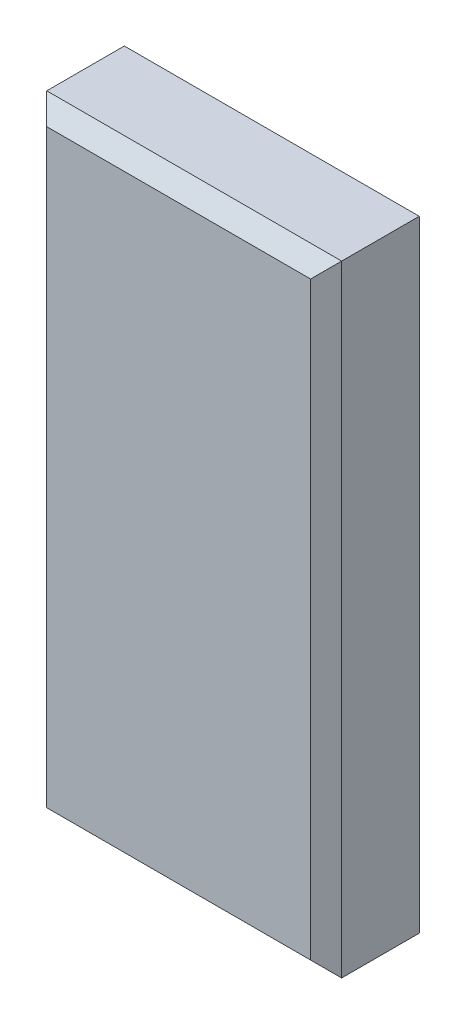
ISO-10303-21;
HEADER;
FILE_DESCRIPTION(('STEP AP214'),'2;1');
FILE_NAME('part.step','',(''),(''),'','','');
FILE_SCHEMA(('AUTOMOTIVE_DESIGN { 1 0 10303 214 1 1 1 1 }'));
ENDSEC;
DATA;
#1=APPLICATION_CONTEXT('core data for automotive mechanical design processes');
#2=APPLICATION_PROTOCOL_DEFINITION('international standard','automotive_design',2000,#1);
#3=PRODUCT_CONTEXT('',#1,'mechanical');
#4=PRODUCT('Part','Part','',(#3));
#5=PRODUCT_RELATED_PRODUCT_CATEGORY('part','',(#4));
#6=PRODUCT_DEFINITION_FORMATION('','',#4);
#7=PRODUCT_DEFINITION_CONTEXT('part definition',#1,'design');
#8=PRODUCT_DEFINITION('design','',#6,#7);
#9=PRODUCT_DEFINITION_SHAPE('','',#8);
#10=(LENGTH_UNIT() NAMED_UNIT(*) SI_UNIT(.MILLI.,.METRE.));
#11=(NAMED_UNIT(*) PLANE_ANGLE_UNIT() SI_UNIT($,.RADIAN.));
#12=(NAMED_UNIT(*) SI_UNIT($,.STERADIAN.) SOLID_ANGLE_UNIT());
#13=UNCERTAINTY_MEASURE_WITH_UNIT(LENGTH_MEASURE(1.E-05),#10,'distance_accuracy_value','');
#14=(GEOMETRIC_REPRESENTATION_CONTEXT(3) GLOBAL_UNCERTAINTY_ASSIGNED_CONTEXT((#13)) GLOBAL_UNIT_ASSIGNED_CONTEXT((#10,
#11,#12)) REPRESENTATION_CONTEXT('',''));
#15=CARTESIAN_POINT('',(0.,0.,0.));
#16=DIRECTION('',(0.,0.,1.));
#17=DIRECTION('',(1.,0.,0.));
#18=AXIS2_PLACEMENT_3D('',#15,#16,#17);
#19=CARTESIAN_POINT('',(9.5,20.,7.));
#20=DIRECTION('',(-1.,0.,0.));
#21=DIRECTION('',(0.,-1.,0.));
#22=AXIS2_PLACEMENT_3D('',#19,#20,#21);
#23=PLANE('',#22);
#24=DIRECTION('',(0.,0.,-1.));
#25=VECTOR('',#24,1.);
#26=CARTESIAN_POINT('',(9.5,-20.,7.));
#27=LINE('',#26,#25);
#28=CARTESIAN_POINT('',(9.5,-20.,6.));
#29=VERTEX_POINT('',#28);
#30=CARTESIAN_POINT('',(9.5,-20.,1.));
#31=VERTEX_POINT('',#30);
#32=EDGE_CURVE('E145',#29,#31,#27,.T.);
#33=ORIENTED_EDGE('',*,*,#32,.T.);
#34=DIRECTION('',(0.,1.,0.));
#35=VECTOR('',#34,1.);
#36=CARTESIAN_POINT('',(9.5,20.,1.));
#37=LINE('',#36,#35);
#38=CARTESIAN_POINT('',(9.5,20.,1.));
#39=VERTEX_POINT('',#38);
#40=EDGE_CURVE('E154',#31,#39,#37,.T.);
#41=ORIENTED_EDGE('',*,*,#40,.T.);
#42=DIRECTION('',(0.,0.,-1.));
#43=VECTOR('',#42,1.);
#44=CARTESIAN_POINT('',(9.5,20.,7.));
#45=LINE('',#44,#43);
#46=CARTESIAN_POINT('',(9.5,20.,6.));
#47=VERTEX_POINT('',#46);
#48=EDGE_CURVE('E123',#47,#39,#45,.T.);
#49=ORIENTED_EDGE('',*,*,#48,.F.);
#50=DIRECTION('',(0.,-1.,0.));
#51=VECTOR('',#50,1.);
#52=CARTESIAN_POINT('',(9.5,-20.,6.));
#53=LINE('',#52,#51);
#54=EDGE_CURVE('E156',#47,#29,#53,.T.);
#55=ORIENTED_EDGE('',*,*,#54,.T.);
#56=EDGE_LOOP('',(#33,#41,#49,#55));
#57=FACE_BOUND('',#56,.T.);
#58=ADVANCED_FACE('F35',(#57),#23,.F.);
#59=CARTESIAN_POINT('',(-9.5,20.,7.));
#60=DIRECTION('',(0.,-1.,0.));
#61=DIRECTION('',(0.,0.,-1.));
#62=AXIS2_PLACEMENT_3D('',#59,#60,#61);
#63=PLANE('',#62);
#64=ORIENTED_EDGE('',*,*,#48,.T.);
#65=DIRECTION('',(-1.,0.,0.));
#66=VECTOR('',#65,1.);
#67=CARTESIAN_POINT('',(-9.5,20.,1.));
#68=LINE('',#67,#66);
#69=CARTESIAN_POINT('',(-9.5,20.,1.));
#70=VERTEX_POINT('',#69);
#71=EDGE_CURVE('E122',#39,#70,#68,.T.);
#72=ORIENTED_EDGE('',*,*,#71,.T.);
#73=DIRECTION('',(0.,0.,-1.));
#74=VECTOR('',#73,1.);
#75=CARTESIAN_POINT('',(-9.5,20.,7.));
#76=LINE('',#75,#74);
#77=CARTESIAN_POINT('',(-9.5,20.,6.));
#78=VERTEX_POINT('',#77);
#79=EDGE_CURVE('E105',#78,#70,#76,.T.);
#80=ORIENTED_EDGE('',*,*,#79,.F.);
#81=DIRECTION('',(1.,0.,0.));
#82=VECTOR('',#81,1.);
#83=CARTESIAN_POINT('',(9.5,20.,6.));
#84=LINE('',#83,#82);
#85=EDGE_CURVE('E119',#78,#47,#84,.T.);
#86=ORIENTED_EDGE('',*,*,#85,.T.);
#87=EDGE_LOOP('',(#64,#72,#80,#86));
#88=FACE_BOUND('',#87,.T.);
#89=ADVANCED_FACE('F118',(#88),#63,.F.);
#90=CARTESIAN_POINT('',(-9.5,20.,7.));
#91=DIRECTION('',(1.,0.,0.));
#92=DIRECTION('',(0.,1.,0.));
#93=AXIS2_PLACEMENT_3D('',#90,#91,#92);
#94=PLANE('',#93);
#95=ORIENTED_EDGE('',*,*,#79,.T.);
#96=DIRECTION('',(0.,-1.,0.));
#97=VECTOR('',#96,1.);
#98=CARTESIAN_POINT('',(-9.5,20.,1.));
#99=LINE('',#98,#97);
#100=CARTESIAN_POINT('',(-9.5,-20.,1.));
#101=VERTEX_POINT('',#100);
#102=EDGE_CURVE('E111',#70,#101,#99,.T.);
#103=ORIENTED_EDGE('',*,*,#102,.T.);
#104=DIRECTION('',(0.,0.,-1.));
#105=VECTOR('',#104,1.);
#106=CARTESIAN_POINT('',(-9.5,-20.,7.));
#107=LINE('',#106,#105);
#108=CARTESIAN_POINT('',(-9.5,-20.,6.));
#109=VERTEX_POINT('',#108);
#110=EDGE_CURVE('E107',#109,#101,#107,.T.);
#111=ORIENTED_EDGE('',*,*,#110,.F.);
#112=DIRECTION('',(0.,1.,0.));
#113=VECTOR('',#112,1.);
#114=CARTESIAN_POINT('',(-9.5,20.,6.));
#115=LINE('',#114,#113);
#116=EDGE_CURVE('E102',#109,#78,#115,.T.);
#117=ORIENTED_EDGE('',*,*,#116,.T.);
#118=EDGE_LOOP('',(#95,#103,#111,#117));
#119=FACE_BOUND('',#118,.T.);
#120=ADVANCED_FACE('F104',(#119),#94,.F.);
#121=CARTESIAN_POINT('',(-9.5,-20.,7.));
#122=DIRECTION('',(0.,1.,0.));
#123=DIRECTION('',(0.,0.,1.));
#124=AXIS2_PLACEMENT_3D('',#121,#122,#123);
#125=PLANE('',#124);
#126=ORIENTED_EDGE('',*,*,#110,.T.);
#127=DIRECTION('',(1.,0.,0.));
#128=VECTOR('',#127,1.);
#129=CARTESIAN_POINT('',(-9.5,-20.,1.));
#130=LINE('',#129,#128);
#131=EDGE_CURVE('E158',#101,#31,#130,.T.);
#132=ORIENTED_EDGE('',*,*,#131,.T.);
#133=ORIENTED_EDGE('',*,*,#32,.F.);
#134=DIRECTION('',(-1.,0.,0.));
#135=VECTOR('',#134,1.);
#136=CARTESIAN_POINT('',(-9.5,-20.,6.));
#137=LINE('',#136,#135);
#138=EDGE_CURVE('E160',#29,#109,#137,.T.);
#139=ORIENTED_EDGE('',*,*,#138,.T.);
#140=EDGE_LOOP('',(#126,#132,#133,#139));
#141=FACE_BOUND('',#140,.T.);
#142=ADVANCED_FACE('F198',(#141),#125,.F.);
#143=CARTESIAN_POINT('',(0.,0.,7.));
#144=DIRECTION('',(0.,0.,1.));
#145=DIRECTION('',(1.,0.,0.));
#146=AXIS2_PLACEMENT_3D('',#143,#144,#145);
#147=PLANE('',#146);
#148=DIRECTION('',(0.,-1.,0.));
#149=VECTOR('',#148,1.);
#150=CARTESIAN_POINT('',(-8.49999999999999,-20.,7.));
#151=LINE('',#150,#149);
#152=CARTESIAN_POINT('',(-8.5,19.,7.));
#153=VERTEX_POINT('',#152);
#154=CARTESIAN_POINT('',(-8.49999999999999,-19.,7.));
#155=VERTEX_POINT('',#154);
#156=EDGE_CURVE('E45',#153,#155,#151,.T.);
#157=ORIENTED_EDGE('',*,*,#156,.T.);
#158=DIRECTION('',(1.,0.,0.));
#159=VECTOR('',#158,1.);
#160=CARTESIAN_POINT('',(9.5,-19.,7.));
#161=LINE('',#160,#159);
#162=CARTESIAN_POINT('',(8.5,-19.,7.));
#163=VERTEX_POINT('',#162);
#164=EDGE_CURVE('E11',#155,#163,#161,.T.);
#165=ORIENTED_EDGE('',*,*,#164,.T.);
#166=DIRECTION('',(0.,1.,0.));
#167=VECTOR('',#166,1.);
#168=CARTESIAN_POINT('',(8.5,20.,7.));
#169=LINE('',#168,#167);
#170=CARTESIAN_POINT('',(8.5,19.,7.));
#171=VERTEX_POINT('',#170);
#172=EDGE_CURVE('E152',#163,#171,#169,.T.);
#173=ORIENTED_EDGE('',*,*,#172,.T.);
#174=DIRECTION('',(-1.,0.,0.));
#175=VECTOR('',#174,1.);
#176=CARTESIAN_POINT('',(-9.5,19.,7.));
#177=LINE('',#176,#175);
#178=EDGE_CURVE('E56',#171,#153,#177,.T.);
#179=ORIENTED_EDGE('',*,*,#178,.T.);
#180=EDGE_LOOP('',(#157,#165,#173,#179));
#181=FACE_BOUND('',#180,.T.);
#182=ADVANCED_FACE('F204',(#181),#147,.T.);
#183=CARTESIAN_POINT('',(0.,0.,0.));
#184=DIRECTION('',(0.,0.,1.));
#185=DIRECTION('',(1.,0.,0.));
#186=AXIS2_PLACEMENT_3D('',#183,#184,#185);
#187=PLANE('',#186);
#188=DIRECTION('',(0.,1.,0.));
#189=VECTOR('',#188,1.);
#190=CARTESIAN_POINT('',(-8.5,0.,0.));
#191=LINE('',#190,#189);
#192=CARTESIAN_POINT('',(-8.49999999999999,-19.,0.));
#193=VERTEX_POINT('',#192);
#194=CARTESIAN_POINT('',(-8.5,19.,0.));
#195=VERTEX_POINT('',#194);
#196=EDGE_CURVE('E165',#193,#195,#191,.T.);
#197=ORIENTED_EDGE('',*,*,#196,.T.);
#198=DIRECTION('',(1.,0.,0.));
#199=VECTOR('',#198,1.);
#200=CARTESIAN_POINT('',(0.,19.,0.));
#201=LINE('',#200,#199);
#202=CARTESIAN_POINT('',(8.5,19.,0.));
#203=VERTEX_POINT('',#202);
#204=EDGE_CURVE('E112',#195,#203,#201,.T.);
#205=ORIENTED_EDGE('',*,*,#204,.T.);
#206=DIRECTION('',(0.,-1.,0.));
#207=VECTOR('',#206,1.);
#208=CARTESIAN_POINT('',(8.5,0.,0.));
#209=LINE('',#208,#207);
#210=CARTESIAN_POINT('',(8.5,-19.,0.));
#211=VERTEX_POINT('',#210);
#212=EDGE_CURVE('E169',#203,#211,#209,.T.);
#213=ORIENTED_EDGE('',*,*,#212,.T.);
#214=DIRECTION('',(-1.,0.,0.));
#215=VECTOR('',#214,1.);
#216=CARTESIAN_POINT('',(0.,-19.,0.));
#217=LINE('',#216,#215);
#218=EDGE_CURVE('E167',#211,#193,#217,.T.);
#219=ORIENTED_EDGE('',*,*,#218,.T.);
#220=EDGE_LOOP('',(#197,#205,#213,#219));
#221=FACE_BOUND('',#220,.T.);
#222=ADVANCED_FACE('F206',(#221),#187,.F.);
#223=CARTESIAN_POINT('',(-9.5,-20.,1.));
#224=DIRECTION('',(0.,0.707106781186547,0.707106781186547));
#225=DIRECTION('',(1.,0.,0.));
#226=AXIS2_PLACEMENT_3D('',#223,#224,#225);
#227=PLANE('',#226);
#228=DIRECTION('',(0.577350269189626,0.577350269189626,-0.577350269189626));
#229=VECTOR('',#228,1.);
#230=CARTESIAN_POINT('',(-9.5,-20.,1.));
#231=LINE('',#230,#229);
#232=EDGE_CURVE('E146',#193,#101,#231,.F.);
#233=ORIENTED_EDGE('',*,*,#232,.F.);
#234=ORIENTED_EDGE('',*,*,#218,.F.);
#235=DIRECTION('',(-0.577350269189626,0.577350269189626,-0.577350269189626));
#236=VECTOR('',#235,1.);
#237=CARTESIAN_POINT('',(-3.83333333333333,-6.66666666666667,-12.3333333333333));
#238=LINE('',#237,#236);
#239=EDGE_CURVE('E142',#31,#211,#238,.T.);
#240=ORIENTED_EDGE('',*,*,#239,.F.);
#241=ORIENTED_EDGE('',*,*,#131,.F.);
#242=EDGE_LOOP('',(#233,#234,#240,#241));
#243=FACE_BOUND('',#242,.T.);
#244=ADVANCED_FACE('F185',(#243),#227,.F.);
#245=CARTESIAN_POINT('',(9.5,20.,1.));
#246=DIRECTION('',(-0.707106781186547,0.,0.707106781186547));
#247=DIRECTION('',(0.,1.,0.));
#248=AXIS2_PLACEMENT_3D('',#245,#246,#247);
#249=PLANE('',#248);
#250=ORIENTED_EDGE('',*,*,#239,.T.);
#251=ORIENTED_EDGE('',*,*,#212,.F.);
#252=DIRECTION('',(0.577350269189626,0.577350269189626,0.577350269189626));
#253=VECTOR('',#252,1.);
#254=CARTESIAN_POINT('',(9.5,20.,1.));
#255=LINE('',#254,#253);
#256=EDGE_CURVE('E133',#39,#203,#255,.F.);
#257=ORIENTED_EDGE('',*,*,#256,.F.);
#258=ORIENTED_EDGE('',*,*,#40,.F.);
#259=EDGE_LOOP('',(#250,#251,#257,#258));
#260=FACE_BOUND('',#259,.T.);
#261=ADVANCED_FACE('F189',(#260),#249,.F.);
#262=CARTESIAN_POINT('',(-9.5,20.,1.));
#263=DIRECTION('',(0.707106781186548,0.,0.707106781186547));
#264=DIRECTION('',(0.,-1.,0.));
#265=AXIS2_PLACEMENT_3D('',#262,#263,#264);
#266=PLANE('',#265);
#267=ORIENTED_EDGE('',*,*,#232,.T.);
#268=ORIENTED_EDGE('',*,*,#102,.F.);
#269=DIRECTION('',(0.577350269189626,-0.577350269189626,-0.577350269189626));
#270=VECTOR('',#269,1.);
#271=CARTESIAN_POINT('',(-9.5,20.,1.));
#272=LINE('',#271,#270);
#273=EDGE_CURVE('E132',#195,#70,#272,.F.);
#274=ORIENTED_EDGE('',*,*,#273,.F.);
#275=ORIENTED_EDGE('',*,*,#196,.F.);
#276=EDGE_LOOP('',(#267,#268,#274,#275));
#277=FACE_BOUND('',#276,.T.);
#278=ADVANCED_FACE('F197',(#277),#266,.F.);
#279=CARTESIAN_POINT('',(-9.5,20.,1.));
#280=DIRECTION('',(0.,-0.707106781186547,0.707106781186547));
#281=DIRECTION('',(-1.,0.,0.));
#282=AXIS2_PLACEMENT_3D('',#279,#280,#281);
#283=PLANE('',#282);
#284=ORIENTED_EDGE('',*,*,#256,.T.);
#285=ORIENTED_EDGE('',*,*,#204,.F.);
#286=ORIENTED_EDGE('',*,*,#273,.T.);
#287=ORIENTED_EDGE('',*,*,#71,.F.);
#288=EDGE_LOOP('',(#284,#285,#286,#287));
#289=FACE_BOUND('',#288,.T.);
#290=ADVANCED_FACE('F192',(#289),#283,.F.);
#291=CARTESIAN_POINT('',(0.,19.,7.));
#292=DIRECTION('',(0.,0.707106781186547,0.707106781186547));
#293=DIRECTION('',(1.,0.,0.));
#294=AXIS2_PLACEMENT_3D('',#291,#292,#293);
#295=PLANE('',#294);
#296=DIRECTION('',(-0.577350269189626,-0.577350269189626,0.577350269189626));
#297=VECTOR('',#296,1.);
#298=CARTESIAN_POINT('',(2.16666666666667,12.6666666666667,13.3333333333333));
#299=LINE('',#298,#297);
#300=EDGE_CURVE('E128',#47,#171,#299,.T.);
#301=ORIENTED_EDGE('',*,*,#300,.F.);
#302=ORIENTED_EDGE('',*,*,#85,.F.);
#303=DIRECTION('',(0.577350269189626,-0.577350269189626,0.577350269189626));
#304=VECTOR('',#303,1.);
#305=CARTESIAN_POINT('',(-5.66666666666667,16.1666666666667,9.83333333333333));
#306=LINE('',#305,#304);
#307=EDGE_CURVE('E40',#153,#78,#306,.F.);
#308=ORIENTED_EDGE('',*,*,#307,.F.);
#309=ORIENTED_EDGE('',*,*,#178,.F.);
#310=EDGE_LOOP('',(#301,#302,#308,#309));
#311=FACE_BOUND('',#310,.T.);
#312=ADVANCED_FACE('F38',(#311),#295,.T.);
#313=CARTESIAN_POINT('',(-8.5,0.,7.));
#314=DIRECTION('',(-0.707106781186548,0.,0.707106781186547));
#315=DIRECTION('',(0.,1.,0.));
#316=AXIS2_PLACEMENT_3D('',#313,#314,#315);
#317=PLANE('',#316);
#318=ORIENTED_EDGE('',*,*,#307,.T.);
#319=ORIENTED_EDGE('',*,*,#116,.F.);
#320=DIRECTION('',(0.577350269189626,0.577350269189626,0.577350269189626));
#321=VECTOR('',#320,1.);
#322=CARTESIAN_POINT('',(-2.16666666666667,-12.6666666666667,13.3333333333333));
#323=LINE('',#322,#321);
#324=EDGE_CURVE('E135',#155,#109,#323,.F.);
#325=ORIENTED_EDGE('',*,*,#324,.F.);
#326=ORIENTED_EDGE('',*,*,#156,.F.);
#327=EDGE_LOOP('',(#318,#319,#325,#326));
#328=FACE_BOUND('',#327,.T.);
#329=ADVANCED_FACE('F131',(#328),#317,.T.);
#330=CARTESIAN_POINT('',(8.5,0.,7.));
#331=DIRECTION('',(0.707106781186547,0.,0.707106781186547));
#332=DIRECTION('',(0.,-1.,0.));
#333=AXIS2_PLACEMENT_3D('',#330,#331,#332);
#334=PLANE('',#333);
#335=ORIENTED_EDGE('',*,*,#300,.T.);
#336=ORIENTED_EDGE('',*,*,#172,.F.);
#337=DIRECTION('',(0.577350269189626,-0.577350269189626,-0.577350269189626));
#338=VECTOR('',#337,1.);
#339=CARTESIAN_POINT('',(2.16666666666667,-12.6666666666667,13.3333333333333));
#340=LINE('',#339,#338);
#341=EDGE_CURVE('E138',#29,#163,#340,.F.);
#342=ORIENTED_EDGE('',*,*,#341,.F.);
#343=ORIENTED_EDGE('',*,*,#54,.F.);
#344=EDGE_LOOP('',(#335,#336,#342,#343));
#345=FACE_BOUND('',#344,.T.);
#346=ADVANCED_FACE('F203',(#345),#334,.T.);
#347=CARTESIAN_POINT('',(0.,-19.,7.));
#348=DIRECTION('',(0.,-0.707106781186547,0.707106781186547));
#349=DIRECTION('',(-1.,0.,0.));
#350=AXIS2_PLACEMENT_3D('',#347,#348,#349);
#351=PLANE('',#350);
#352=ORIENTED_EDGE('',*,*,#324,.T.);
#353=ORIENTED_EDGE('',*,*,#138,.F.);
#354=ORIENTED_EDGE('',*,*,#341,.T.);
#355=ORIENTED_EDGE('',*,*,#164,.F.);
#356=EDGE_LOOP('',(#352,#353,#354,#355));
#357=FACE_BOUND('',#356,.T.);
#358=ADVANCED_FACE('F201',(#357),#351,.T.);
#359=CLOSED_SHELL('',(#58,#89,#120,#142,#182,#222,#244,#261,#278,#290,#312,#329,#346,#358));
#360=MANIFOLD_SOLID_BREP('B2',#359);
#361=ADVANCED_BREP_SHAPE_REPRESENTATION('',(#18,#360),#14);
#362=SHAPE_DEFINITION_REPRESENTATION(#9,#361);
ENDSEC;
END-ISO-10303-21;
